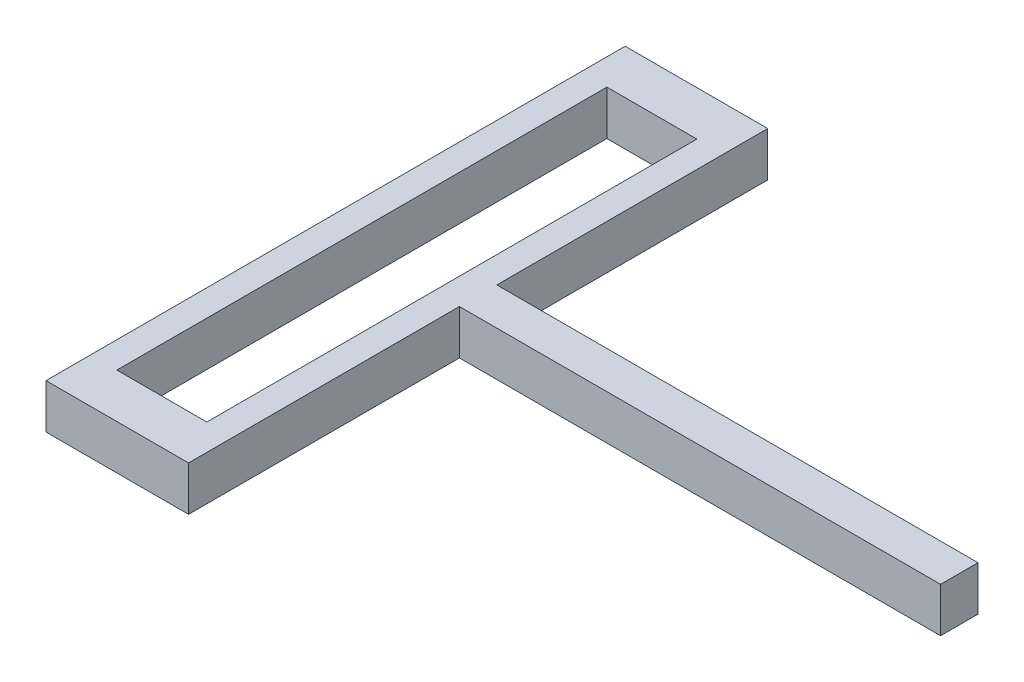
ISO-10303-21;
HEADER;
FILE_DESCRIPTION(('STEP AP214'),'2;1');
FILE_NAME('part.step','',(''),(''),'','','');
FILE_SCHEMA(('AUTOMOTIVE_DESIGN { 1 0 10303 214 1 1 1 1 }'));
ENDSEC;
DATA;
#1=APPLICATION_CONTEXT('core data for automotive mechanical design processes');
#2=APPLICATION_PROTOCOL_DEFINITION('international standard','automotive_design',2000,#1);
#3=PRODUCT_CONTEXT('',#1,'mechanical');
#4=PRODUCT('Part','Part','',(#3));
#5=PRODUCT_RELATED_PRODUCT_CATEGORY('part','',(#4));
#6=PRODUCT_DEFINITION_FORMATION('','',#4);
#7=PRODUCT_DEFINITION_CONTEXT('part definition',#1,'design');
#8=PRODUCT_DEFINITION('design','',#6,#7);
#9=PRODUCT_DEFINITION_SHAPE('','',#8);
#10=(LENGTH_UNIT() NAMED_UNIT(*) SI_UNIT(.MILLI.,.METRE.));
#11=(NAMED_UNIT(*) PLANE_ANGLE_UNIT() SI_UNIT($,.RADIAN.));
#12=(NAMED_UNIT(*) SI_UNIT($,.STERADIAN.) SOLID_ANGLE_UNIT());
#13=UNCERTAINTY_MEASURE_WITH_UNIT(LENGTH_MEASURE(1.E-05),#10,'distance_accuracy_value','');
#14=(GEOMETRIC_REPRESENTATION_CONTEXT(3) GLOBAL_UNCERTAINTY_ASSIGNED_CONTEXT((#13)) GLOBAL_UNIT_ASSIGNED_CONTEXT((#10,
#11,#12)) REPRESENTATION_CONTEXT('',''));
#15=CARTESIAN_POINT('',(0.,0.,0.));
#16=DIRECTION('',(0.,0.,1.));
#17=DIRECTION('',(1.,0.,0.));
#18=AXIS2_PLACEMENT_3D('',#15,#16,#17);
#19=CARTESIAN_POINT('',(-26.7064885496183,5.,0.));
#20=DIRECTION('',(-1.,0.,0.));
#21=DIRECTION('',(0.,0.,1.));
#22=AXIS2_PLACEMENT_3D('',#19,#20,#21);
#23=PLANE('',#22);
#24=DIRECTION('',(0.,0.,-1.));
#25=VECTOR('',#24,1.);
#26=CARTESIAN_POINT('',(-26.7064885496183,0.,0.));
#27=LINE('',#26,#25);
#28=CARTESIAN_POINT('',(-26.7064885496183,0.,27.5));
#29=VERTEX_POINT('',#28);
#30=CARTESIAN_POINT('',(-26.7064885496183,0.,-27.5));
#31=VERTEX_POINT('',#30);
#32=EDGE_CURVE('E138',#29,#31,#27,.T.);
#33=ORIENTED_EDGE('',*,*,#32,.T.);
#34=DIRECTION('',(0.,-1.,0.));
#35=VECTOR('',#34,1.);
#36=CARTESIAN_POINT('',(-26.7064885496183,5.,-27.5));
#37=LINE('',#36,#35);
#38=CARTESIAN_POINT('',(-26.7064885496183,5.,-27.5));
#39=VERTEX_POINT('',#38);
#40=EDGE_CURVE('E11',#39,#31,#37,.T.);
#41=ORIENTED_EDGE('',*,*,#40,.F.);
#42=DIRECTION('',(0.,0.,-1.));
#43=VECTOR('',#42,1.);
#44=CARTESIAN_POINT('',(-26.7064885496183,5.,0.));
#45=LINE('',#44,#43);
#46=CARTESIAN_POINT('',(-26.7064885496183,5.,27.5));
#47=VERTEX_POINT('',#46);
#48=EDGE_CURVE('E95',#47,#39,#45,.T.);
#49=ORIENTED_EDGE('',*,*,#48,.F.);
#50=DIRECTION('',(0.,-1.,0.));
#51=VECTOR('',#50,1.);
#52=CARTESIAN_POINT('',(-26.7064885496183,5.,27.5));
#53=LINE('',#52,#51);
#54=EDGE_CURVE('E207',#47,#29,#53,.T.);
#55=ORIENTED_EDGE('',*,*,#54,.T.);
#56=EDGE_LOOP('',(#33,#41,#49,#55));
#57=FACE_BOUND('',#56,.T.);
#58=ADVANCED_FACE('F39',(#57),#23,.F.);
#59=CARTESIAN_POINT('',(-26.7064885496183,5.,-27.5));
#60=DIRECTION('',(0.,0.,-1.));
#61=DIRECTION('',(-1.,0.,0.));
#62=AXIS2_PLACEMENT_3D('',#59,#60,#61);
#63=PLANE('',#62);
#64=DIRECTION('',(1.,0.,0.));
#65=VECTOR('',#64,1.);
#66=CARTESIAN_POINT('',(-26.7064885496183,0.,-27.5));
#67=LINE('',#66,#65);
#68=CARTESIAN_POINT('',(-16.6064885496183,0.,-27.5));
#69=VERTEX_POINT('',#68);
#70=EDGE_CURVE('E141',#31,#69,#67,.T.);
#71=ORIENTED_EDGE('',*,*,#70,.T.);
#72=DIRECTION('',(0.,-1.,0.));
#73=VECTOR('',#72,1.);
#74=CARTESIAN_POINT('',(-16.6064885496183,5.,-27.5));
#75=LINE('',#74,#73);
#76=CARTESIAN_POINT('',(-16.6064885496183,5.,-27.5));
#77=VERTEX_POINT('',#76);
#78=EDGE_CURVE('E48',#77,#69,#75,.T.);
#79=ORIENTED_EDGE('',*,*,#78,.F.);
#80=DIRECTION('',(1.,0.,0.));
#81=VECTOR('',#80,1.);
#82=CARTESIAN_POINT('',(-26.7064885496183,5.,-27.5));
#83=LINE('',#82,#81);
#84=EDGE_CURVE('E231',#39,#77,#83,.T.);
#85=ORIENTED_EDGE('',*,*,#84,.F.);
#86=ORIENTED_EDGE('',*,*,#40,.T.);
#87=EDGE_LOOP('',(#71,#79,#85,#86));
#88=FACE_BOUND('',#87,.T.);
#89=ADVANCED_FACE('F299',(#88),#63,.F.);
#90=CARTESIAN_POINT('',(-16.6064885496183,5.,-27.5));
#91=DIRECTION('',(1.,0.,0.));
#92=DIRECTION('',(0.,0.,-1.));
#93=AXIS2_PLACEMENT_3D('',#90,#91,#92);
#94=PLANE('',#93);
#95=DIRECTION('',(0.,0.,1.));
#96=VECTOR('',#95,1.);
#97=CARTESIAN_POINT('',(-16.6064885496183,0.,-27.5));
#98=LINE('',#97,#96);
#99=CARTESIAN_POINT('',(-16.6064885496183,0.,27.5));
#100=VERTEX_POINT('',#99);
#101=EDGE_CURVE('E145',#69,#100,#98,.T.);
#102=ORIENTED_EDGE('',*,*,#101,.T.);
#103=DIRECTION('',(0.,-1.,0.));
#104=VECTOR('',#103,1.);
#105=CARTESIAN_POINT('',(-16.6064885496183,5.,27.5));
#106=LINE('',#105,#104);
#107=CARTESIAN_POINT('',(-16.6064885496183,5.,27.5));
#108=VERTEX_POINT('',#107);
#109=EDGE_CURVE('E210',#108,#100,#106,.T.);
#110=ORIENTED_EDGE('',*,*,#109,.F.);
#111=DIRECTION('',(0.,0.,1.));
#112=VECTOR('',#111,1.);
#113=CARTESIAN_POINT('',(-16.6064885496183,5.,-27.5));
#114=LINE('',#113,#112);
#115=EDGE_CURVE('E178',#77,#108,#114,.T.);
#116=ORIENTED_EDGE('',*,*,#115,.F.);
#117=ORIENTED_EDGE('',*,*,#78,.T.);
#118=EDGE_LOOP('',(#102,#110,#116,#117));
#119=FACE_BOUND('',#118,.T.);
#120=ADVANCED_FACE('F173',(#119),#94,.F.);
#121=CARTESIAN_POINT('',(40.3435114503817,5.,-2.1));
#122=DIRECTION('',(-1.,0.,0.));
#123=DIRECTION('',(0.,0.,1.));
#124=AXIS2_PLACEMENT_3D('',#121,#122,#123);
#125=PLANE('',#124);
#126=DIRECTION('',(0.,0.,-1.));
#127=VECTOR('',#126,1.);
#128=CARTESIAN_POINT('',(40.3435114503817,0.,-2.1));
#129=LINE('',#128,#127);
#130=CARTESIAN_POINT('',(40.3435114503817,0.,2.1));
#131=VERTEX_POINT('',#130);
#132=CARTESIAN_POINT('',(40.3435114503817,0.,-2.1));
#133=VERTEX_POINT('',#132);
#134=EDGE_CURVE('E149',#131,#133,#129,.T.);
#135=ORIENTED_EDGE('',*,*,#134,.T.);
#136=DIRECTION('',(0.,-1.,0.));
#137=VECTOR('',#136,1.);
#138=CARTESIAN_POINT('',(40.3435114503817,5.,-2.1));
#139=LINE('',#138,#137);
#140=CARTESIAN_POINT('',(40.3435114503817,5.,-2.1));
#141=VERTEX_POINT('',#140);
#142=EDGE_CURVE('E124',#141,#133,#139,.T.);
#143=ORIENTED_EDGE('',*,*,#142,.F.);
#144=DIRECTION('',(0.,0.,-1.));
#145=VECTOR('',#144,1.);
#146=CARTESIAN_POINT('',(40.3435114503817,5.,-2.1));
#147=LINE('',#146,#145);
#148=CARTESIAN_POINT('',(40.3435114503817,5.,2.1));
#149=VERTEX_POINT('',#148);
#150=EDGE_CURVE('E113',#149,#141,#147,.T.);
#151=ORIENTED_EDGE('',*,*,#150,.F.);
#152=DIRECTION('',(0.,-1.,0.));
#153=VECTOR('',#152,1.);
#154=CARTESIAN_POINT('',(40.3435114503817,5.,2.1));
#155=LINE('',#154,#153);
#156=EDGE_CURVE('E214',#149,#131,#155,.T.);
#157=ORIENTED_EDGE('',*,*,#156,.T.);
#158=EDGE_LOOP('',(#135,#143,#151,#157));
#159=FACE_BOUND('',#158,.T.);
#160=ADVANCED_FACE('F315',(#159),#125,.F.);
#161=CARTESIAN_POINT('',(-13.6564885496183,5.,-2.1));
#162=DIRECTION('',(0.,0.,1.));
#163=DIRECTION('',(1.,0.,0.));
#164=AXIS2_PLACEMENT_3D('',#161,#162,#163);
#165=PLANE('',#164);
#166=DIRECTION('',(-1.,0.,0.));
#167=VECTOR('',#166,1.);
#168=CARTESIAN_POINT('',(-13.6564885496183,0.,-2.1));
#169=LINE('',#168,#167);
#170=CARTESIAN_POINT('',(-13.6564885496183,0.,-2.1));
#171=VERTEX_POINT('',#170);
#172=EDGE_CURVE('E122',#133,#171,#169,.T.);
#173=ORIENTED_EDGE('',*,*,#172,.T.);
#174=DIRECTION('',(0.,-1.,0.));
#175=VECTOR('',#174,1.);
#176=CARTESIAN_POINT('',(-13.6564885496183,5.,-2.1));
#177=LINE('',#176,#175);
#178=CARTESIAN_POINT('',(-13.6564885496183,5.,-2.1));
#179=VERTEX_POINT('',#178);
#180=EDGE_CURVE('E119',#179,#171,#177,.T.);
#181=ORIENTED_EDGE('',*,*,#180,.F.);
#182=DIRECTION('',(-1.,0.,0.));
#183=VECTOR('',#182,1.);
#184=CARTESIAN_POINT('',(-13.6564885496183,5.,-2.1));
#185=LINE('',#184,#183);
#186=EDGE_CURVE('E106',#141,#179,#185,.T.);
#187=ORIENTED_EDGE('',*,*,#186,.F.);
#188=ORIENTED_EDGE('',*,*,#142,.T.);
#189=EDGE_LOOP('',(#173,#181,#187,#188));
#190=FACE_BOUND('',#189,.T.);
#191=ADVANCED_FACE('F120',(#190),#165,.F.);
#192=CARTESIAN_POINT('',(-13.6564885496183,5.,-32.5));
#193=DIRECTION('',(-1.,0.,0.));
#194=DIRECTION('',(0.,0.,1.));
#195=AXIS2_PLACEMENT_3D('',#192,#193,#194);
#196=PLANE('',#195);
#197=DIRECTION('',(0.,0.,-1.));
#198=VECTOR('',#197,1.);
#199=CARTESIAN_POINT('',(-13.6564885496183,0.,-32.5));
#200=LINE('',#199,#198);
#201=CARTESIAN_POINT('',(-13.6564885496183,0.,-32.5));
#202=VERTEX_POINT('',#201);
#203=EDGE_CURVE('E80',#171,#202,#200,.T.);
#204=ORIENTED_EDGE('',*,*,#203,.T.);
#205=DIRECTION('',(0.,-1.,0.));
#206=VECTOR('',#205,1.);
#207=CARTESIAN_POINT('',(-13.6564885496183,5.,-32.5));
#208=LINE('',#207,#206);
#209=CARTESIAN_POINT('',(-13.6564885496183,5.,-32.5));
#210=VERTEX_POINT('',#209);
#211=EDGE_CURVE('E125',#210,#202,#208,.T.);
#212=ORIENTED_EDGE('',*,*,#211,.F.);
#213=DIRECTION('',(0.,0.,-1.));
#214=VECTOR('',#213,1.);
#215=CARTESIAN_POINT('',(-13.6564885496183,5.,-32.5));
#216=LINE('',#215,#214);
#217=EDGE_CURVE('E110',#179,#210,#216,.T.);
#218=ORIENTED_EDGE('',*,*,#217,.F.);
#219=ORIENTED_EDGE('',*,*,#180,.T.);
#220=EDGE_LOOP('',(#204,#212,#218,#219));
#221=FACE_BOUND('',#220,.T.);
#222=ADVANCED_FACE('F127',(#221),#196,.F.);
#223=CARTESIAN_POINT('',(-29.6564885496183,5.,-32.5));
#224=DIRECTION('',(0.,0.,1.));
#225=DIRECTION('',(1.,0.,0.));
#226=AXIS2_PLACEMENT_3D('',#223,#224,#225);
#227=PLANE('',#226);
#228=DIRECTION('',(-1.,0.,0.));
#229=VECTOR('',#228,1.);
#230=CARTESIAN_POINT('',(-29.6564885496183,0.,-32.5));
#231=LINE('',#230,#229);
#232=CARTESIAN_POINT('',(-29.6564885496183,0.,-32.5));
#233=VERTEX_POINT('',#232);
#234=EDGE_CURVE('E86',#202,#233,#231,.T.);
#235=ORIENTED_EDGE('',*,*,#234,.T.);
#236=DIRECTION('',(0.,-1.,0.));
#237=VECTOR('',#236,1.);
#238=CARTESIAN_POINT('',(-29.6564885496183,5.,-32.5));
#239=LINE('',#238,#237);
#240=CARTESIAN_POINT('',(-29.6564885496183,5.,-32.5));
#241=VERTEX_POINT('',#240);
#242=EDGE_CURVE('E137',#241,#233,#239,.T.);
#243=ORIENTED_EDGE('',*,*,#242,.F.);
#244=DIRECTION('',(-1.,0.,0.));
#245=VECTOR('',#244,1.);
#246=CARTESIAN_POINT('',(-29.6564885496183,5.,-32.5));
#247=LINE('',#246,#245);
#248=EDGE_CURVE('E56',#210,#241,#247,.T.);
#249=ORIENTED_EDGE('',*,*,#248,.F.);
#250=ORIENTED_EDGE('',*,*,#211,.T.);
#251=EDGE_LOOP('',(#235,#243,#249,#250));
#252=FACE_BOUND('',#251,.T.);
#253=ADVANCED_FACE('F327',(#252),#227,.F.);
#254=CARTESIAN_POINT('',(-29.6564885496183,5.,0.));
#255=DIRECTION('',(1.,0.,0.));
#256=DIRECTION('',(0.,0.,-1.));
#257=AXIS2_PLACEMENT_3D('',#254,#255,#256);
#258=PLANE('',#257);
#259=DIRECTION('',(0.,0.,1.));
#260=VECTOR('',#259,1.);
#261=CARTESIAN_POINT('',(-29.6564885496183,0.,0.));
#262=LINE('',#261,#260);
#263=CARTESIAN_POINT('',(-29.6564885496183,0.,32.5));
#264=VERTEX_POINT('',#263);
#265=EDGE_CURVE('E158',#233,#264,#262,.T.);
#266=ORIENTED_EDGE('',*,*,#265,.T.);
#267=DIRECTION('',(0.,-1.,0.));
#268=VECTOR('',#267,1.);
#269=CARTESIAN_POINT('',(-29.6564885496183,5.,32.5));
#270=LINE('',#269,#268);
#271=CARTESIAN_POINT('',(-29.6564885496183,5.,32.5));
#272=VERTEX_POINT('',#271);
#273=EDGE_CURVE('E142',#272,#264,#270,.T.);
#274=ORIENTED_EDGE('',*,*,#273,.F.);
#275=DIRECTION('',(0.,0.,1.));
#276=VECTOR('',#275,1.);
#277=CARTESIAN_POINT('',(-29.6564885496183,5.,0.));
#278=LINE('',#277,#276);
#279=EDGE_CURVE('E131',#241,#272,#278,.T.);
#280=ORIENTED_EDGE('',*,*,#279,.F.);
#281=ORIENTED_EDGE('',*,*,#242,.T.);
#282=EDGE_LOOP('',(#266,#274,#280,#281));
#283=FACE_BOUND('',#282,.T.);
#284=ADVANCED_FACE('F285',(#283),#258,.F.);
#285=CARTESIAN_POINT('',(0.,5.,0.));
#286=DIRECTION('',(0.,1.,0.));
#287=DIRECTION('',(0.,0.,1.));
#288=AXIS2_PLACEMENT_3D('',#285,#286,#287);
#289=PLANE('',#288);
#290=DIRECTION('',(1.,0.,0.));
#291=VECTOR('',#290,1.);
#292=CARTESIAN_POINT('',(-26.7064885496183,5.,27.5));
#293=LINE('',#292,#291);
#294=EDGE_CURVE('E211',#47,#108,#293,.T.);
#295=ORIENTED_EDGE('',*,*,#294,.F.);
#296=ORIENTED_EDGE('',*,*,#48,.T.);
#297=ORIENTED_EDGE('',*,*,#84,.T.);
#298=ORIENTED_EDGE('',*,*,#115,.T.);
#299=EDGE_LOOP('',(#295,#296,#297,#298));
#300=FACE_BOUND('',#299,.T.);
#301=ORIENTED_EDGE('',*,*,#279,.T.);
#302=DIRECTION('',(-1.,0.,0.));
#303=VECTOR('',#302,1.);
#304=CARTESIAN_POINT('',(-29.6564885496183,5.,32.5));
#305=LINE('',#304,#303);
#306=CARTESIAN_POINT('',(-13.6564885496183,5.,32.5));
#307=VERTEX_POINT('',#306);
#308=EDGE_CURVE('E194',#307,#272,#305,.T.);
#309=ORIENTED_EDGE('',*,*,#308,.F.);
#310=DIRECTION('',(0.,0.,1.));
#311=VECTOR('',#310,1.);
#312=CARTESIAN_POINT('',(-13.6564885496183,5.,32.5));
#313=LINE('',#312,#311);
#314=CARTESIAN_POINT('',(-13.6564885496183,5.,2.1));
#315=VERTEX_POINT('',#314);
#316=EDGE_CURVE('E200',#315,#307,#313,.T.);
#317=ORIENTED_EDGE('',*,*,#316,.F.);
#318=DIRECTION('',(-1.,0.,0.));
#319=VECTOR('',#318,1.);
#320=CARTESIAN_POINT('',(-13.6564885496183,5.,2.1));
#321=LINE('',#320,#319);
#322=EDGE_CURVE('E239',#149,#315,#321,.T.);
#323=ORIENTED_EDGE('',*,*,#322,.F.);
#324=ORIENTED_EDGE('',*,*,#150,.T.);
#325=ORIENTED_EDGE('',*,*,#186,.T.);
#326=ORIENTED_EDGE('',*,*,#217,.T.);
#327=ORIENTED_EDGE('',*,*,#248,.T.);
#328=EDGE_LOOP('',(#301,#309,#317,#323,#324,#325,#326,#327));
#329=FACE_BOUND('',#328,.T.);
#330=ADVANCED_FACE('F108',(#300,#329),#289,.T.);
#331=CARTESIAN_POINT('',(0.,0.,0.));
#332=DIRECTION('',(0.,1.,0.));
#333=DIRECTION('',(0.,0.,1.));
#334=AXIS2_PLACEMENT_3D('',#331,#332,#333);
#335=PLANE('',#334);
#336=ORIENTED_EDGE('',*,*,#32,.F.);
#337=DIRECTION('',(1.,0.,0.));
#338=VECTOR('',#337,1.);
#339=CARTESIAN_POINT('',(-26.7064885496183,0.,27.5));
#340=LINE('',#339,#338);
#341=EDGE_CURVE('E188',#29,#100,#340,.T.);
#342=ORIENTED_EDGE('',*,*,#341,.T.);
#343=ORIENTED_EDGE('',*,*,#101,.F.);
#344=ORIENTED_EDGE('',*,*,#70,.F.);
#345=EDGE_LOOP('',(#336,#342,#343,#344));
#346=FACE_BOUND('',#345,.T.);
#347=DIRECTION('',(-1.,0.,0.));
#348=VECTOR('',#347,1.);
#349=CARTESIAN_POINT('',(-29.6564885496183,0.,32.5));
#350=LINE('',#349,#348);
#351=CARTESIAN_POINT('',(-13.6564885496183,0.,32.5));
#352=VERTEX_POINT('',#351);
#353=EDGE_CURVE('E251',#352,#264,#350,.T.);
#354=ORIENTED_EDGE('',*,*,#353,.T.);
#355=ORIENTED_EDGE('',*,*,#265,.F.);
#356=ORIENTED_EDGE('',*,*,#234,.F.);
#357=ORIENTED_EDGE('',*,*,#203,.F.);
#358=ORIENTED_EDGE('',*,*,#172,.F.);
#359=ORIENTED_EDGE('',*,*,#134,.F.);
#360=DIRECTION('',(-1.,0.,0.));
#361=VECTOR('',#360,1.);
#362=CARTESIAN_POINT('',(-13.6564885496183,0.,2.1));
#363=LINE('',#362,#361);
#364=CARTESIAN_POINT('',(-13.6564885496183,0.,2.1));
#365=VERTEX_POINT('',#364);
#366=EDGE_CURVE('E195',#131,#365,#363,.T.);
#367=ORIENTED_EDGE('',*,*,#366,.T.);
#368=DIRECTION('',(0.,0.,1.));
#369=VECTOR('',#368,1.);
#370=CARTESIAN_POINT('',(-13.6564885496183,0.,32.5));
#371=LINE('',#370,#369);
#372=EDGE_CURVE('E203',#365,#352,#371,.T.);
#373=ORIENTED_EDGE('',*,*,#372,.T.);
#374=EDGE_LOOP('',(#354,#355,#356,#357,#358,#359,#367,#373));
#375=FACE_BOUND('',#374,.T.);
#376=ADVANCED_FACE('F185',(#346,#375),#335,.F.);
#377=CARTESIAN_POINT('',(-29.6564885496183,5.,32.5));
#378=DIRECTION('',(0.,0.,1.));
#379=DIRECTION('',(1.,0.,0.));
#380=AXIS2_PLACEMENT_3D('',#377,#378,#379);
#381=PLANE('',#380);
#382=ORIENTED_EDGE('',*,*,#353,.F.);
#383=DIRECTION('',(0.,-1.,0.));
#384=VECTOR('',#383,1.);
#385=CARTESIAN_POINT('',(-13.6564885496183,5.,32.5));
#386=LINE('',#385,#384);
#387=EDGE_CURVE('E222',#307,#352,#386,.T.);
#388=ORIENTED_EDGE('',*,*,#387,.F.);
#389=ORIENTED_EDGE('',*,*,#308,.T.);
#390=ORIENTED_EDGE('',*,*,#273,.T.);
#391=EDGE_LOOP('',(#382,#388,#389,#390));
#392=FACE_BOUND('',#391,.T.);
#393=ADVANCED_FACE('F287',(#392),#381,.T.);
#394=CARTESIAN_POINT('',(-13.6564885496183,5.,32.5));
#395=DIRECTION('',(1.,0.,0.));
#396=DIRECTION('',(0.,0.,-1.));
#397=AXIS2_PLACEMENT_3D('',#394,#395,#396);
#398=PLANE('',#397);
#399=ORIENTED_EDGE('',*,*,#372,.F.);
#400=DIRECTION('',(0.,-1.,0.));
#401=VECTOR('',#400,1.);
#402=CARTESIAN_POINT('',(-13.6564885496183,5.,2.1));
#403=LINE('',#402,#401);
#404=EDGE_CURVE('E218',#315,#365,#403,.T.);
#405=ORIENTED_EDGE('',*,*,#404,.F.);
#406=ORIENTED_EDGE('',*,*,#316,.T.);
#407=ORIENTED_EDGE('',*,*,#387,.T.);
#408=EDGE_LOOP('',(#399,#405,#406,#407));
#409=FACE_BOUND('',#408,.T.);
#410=ADVANCED_FACE('F265',(#409),#398,.T.);
#411=CARTESIAN_POINT('',(-13.6564885496183,5.,2.1));
#412=DIRECTION('',(0.,0.,1.));
#413=DIRECTION('',(1.,0.,0.));
#414=AXIS2_PLACEMENT_3D('',#411,#412,#413);
#415=PLANE('',#414);
#416=ORIENTED_EDGE('',*,*,#366,.F.);
#417=ORIENTED_EDGE('',*,*,#156,.F.);
#418=ORIENTED_EDGE('',*,*,#322,.T.);
#419=ORIENTED_EDGE('',*,*,#404,.T.);
#420=EDGE_LOOP('',(#416,#417,#418,#419));
#421=FACE_BOUND('',#420,.T.);
#422=ADVANCED_FACE('F294',(#421),#415,.T.);
#423=CARTESIAN_POINT('',(-26.7064885496183,5.,27.5));
#424=DIRECTION('',(0.,0.,-1.));
#425=DIRECTION('',(-1.,0.,0.));
#426=AXIS2_PLACEMENT_3D('',#423,#424,#425);
#427=PLANE('',#426);
#428=ORIENTED_EDGE('',*,*,#341,.F.);
#429=ORIENTED_EDGE('',*,*,#54,.F.);
#430=ORIENTED_EDGE('',*,*,#294,.T.);
#431=ORIENTED_EDGE('',*,*,#109,.T.);
#432=EDGE_LOOP('',(#428,#429,#430,#431));
#433=FACE_BOUND('',#432,.T.);
#434=ADVANCED_FACE('F304',(#433),#427,.T.);
#435=CLOSED_SHELL('',(#58,#89,#120,#160,#191,#222,#253,#284,#330,#376,#393,#410,#422,#434));
#436=MANIFOLD_SOLID_BREP('B2',#435);
#437=ADVANCED_BREP_SHAPE_REPRESENTATION('',(#18,#436),#14);
#438=SHAPE_DEFINITION_REPRESENTATION(#9,#437);
ENDSEC;
END-ISO-10303-21;
